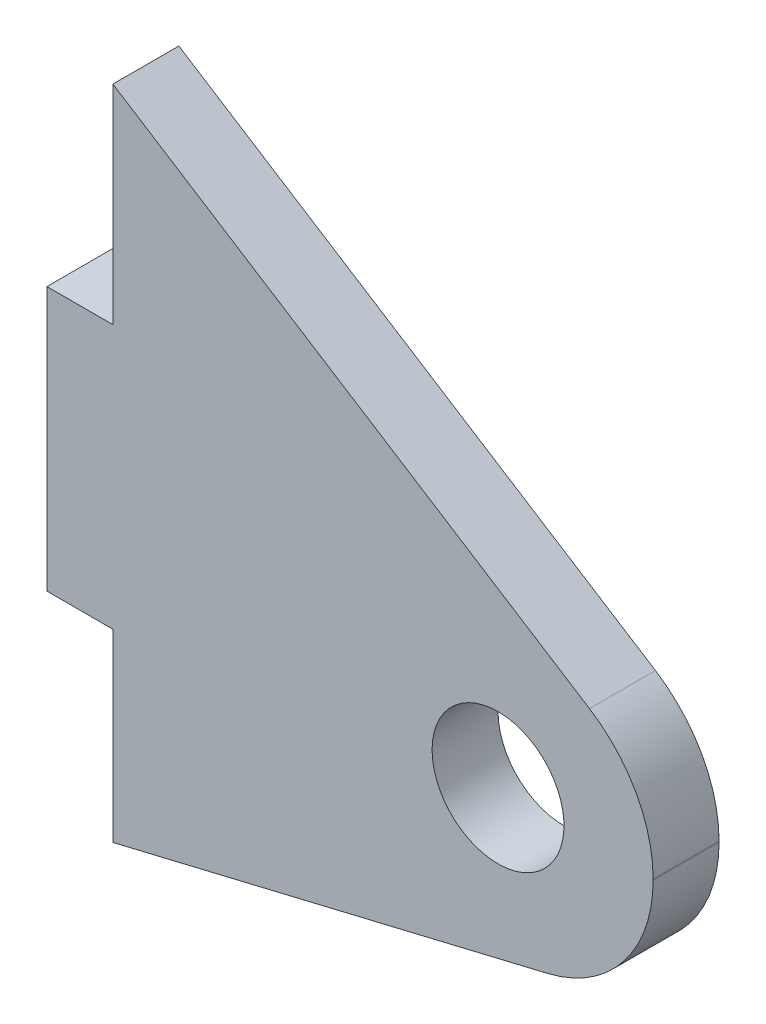
ISO-10303-21;
HEADER;
FILE_DESCRIPTION(('STEP AP214'),'2;1');
FILE_NAME('part.step','',(''),(''),'','','');
FILE_SCHEMA(('AUTOMOTIVE_DESIGN { 1 0 10303 214 1 1 1 1 }'));
ENDSEC;
DATA;
#1=APPLICATION_CONTEXT('core data for automotive mechanical design processes');
#2=APPLICATION_PROTOCOL_DEFINITION('international standard','automotive_design',2000,#1);
#3=PRODUCT_CONTEXT('',#1,'mechanical');
#4=PRODUCT('Part','Part','',(#3));
#5=PRODUCT_RELATED_PRODUCT_CATEGORY('part','',(#4));
#6=PRODUCT_DEFINITION_FORMATION('','',#4);
#7=PRODUCT_DEFINITION_CONTEXT('part definition',#1,'design');
#8=PRODUCT_DEFINITION('design','',#6,#7);
#9=PRODUCT_DEFINITION_SHAPE('','',#8);
#10=(LENGTH_UNIT() NAMED_UNIT(*) SI_UNIT(.MILLI.,.METRE.));
#11=(NAMED_UNIT(*) PLANE_ANGLE_UNIT() SI_UNIT($,.RADIAN.));
#12=(NAMED_UNIT(*) SI_UNIT($,.STERADIAN.) SOLID_ANGLE_UNIT());
#13=UNCERTAINTY_MEASURE_WITH_UNIT(LENGTH_MEASURE(1.E-05),#10,'distance_accuracy_value','');
#14=(GEOMETRIC_REPRESENTATION_CONTEXT(3) GLOBAL_UNCERTAINTY_ASSIGNED_CONTEXT((#13)) GLOBAL_UNIT_ASSIGNED_CONTEXT((#10,
#11,#12)) REPRESENTATION_CONTEXT('',''));
#15=CARTESIAN_POINT('',(0.,0.,0.));
#16=DIRECTION('',(0.,0.,1.));
#17=DIRECTION('',(1.,0.,0.));
#18=AXIS2_PLACEMENT_3D('',#15,#16,#17);
#19=CARTESIAN_POINT('',(0.,64.9120987358869,3.175));
#20=DIRECTION('',(1.,0.,0.));
#21=DIRECTION('',(0.,1.,0.));
#22=AXIS2_PLACEMENT_3D('',#19,#20,#21);
#23=PLANE('',#22);
#24=DIRECTION('',(0.,0.,-1.));
#25=VECTOR('',#24,1.);
#26=CARTESIAN_POINT('',(0.,54.8830926073798,3.175));
#27=LINE('',#26,#25);
#28=CARTESIAN_POINT('',(0.,54.8830926073798,3.175));
#29=VERTEX_POINT('',#28);
#30=CARTESIAN_POINT('',(0.,54.8830926073798,0.));
#31=VERTEX_POINT('',#30);
#32=EDGE_CURVE('E195',#29,#31,#27,.T.);
#33=ORIENTED_EDGE('',*,*,#32,.F.);
#34=DIRECTION('',(0.,-1.,0.));
#35=VECTOR('',#34,1.);
#36=CARTESIAN_POINT('',(0.,64.9120987358869,3.175));
#37=LINE('',#36,#35);
#38=CARTESIAN_POINT('',(0.,64.9120987358869,3.175));
#39=VERTEX_POINT('',#38);
#40=EDGE_CURVE('E138',#39,#29,#37,.T.);
#41=ORIENTED_EDGE('',*,*,#40,.F.);
#42=DIRECTION('',(0.,0.,-1.));
#43=VECTOR('',#42,1.);
#44=CARTESIAN_POINT('',(0.,64.9120987358869,3.175));
#45=LINE('',#44,#43);
#46=CARTESIAN_POINT('',(0.,64.9120987358869,0.));
#47=VERTEX_POINT('',#46);
#48=EDGE_CURVE('E142',#39,#47,#45,.T.);
#49=ORIENTED_EDGE('',*,*,#48,.T.);
#50=DIRECTION('',(0.,-1.,0.));
#51=VECTOR('',#50,1.);
#52=CARTESIAN_POINT('',(0.,64.9120987358869,0.));
#53=LINE('',#52,#51);
#54=EDGE_CURVE('E139',#47,#31,#53,.T.);
#55=ORIENTED_EDGE('',*,*,#54,.T.);
#56=EDGE_LOOP('',(#33,#41,#49,#55));
#57=FACE_BOUND('',#56,.T.);
#58=ADVANCED_FACE('F39',(#57),#23,.F.);
#59=CARTESIAN_POINT('',(0.,42.1830926073798,3.175));
#60=VERTEX_POINT('',#59);
#61=CARTESIAN_POINT('',(0.,33.2930926073798,3.175));
#62=VERTEX_POINT('',#61);
#63=EDGE_CURVE('E128',#60,#62,#37,.T.);
#64=ORIENTED_EDGE('',*,*,#63,.F.);
#65=DIRECTION('',(0.,0.,-1.));
#66=VECTOR('',#65,1.);
#67=CARTESIAN_POINT('',(0.,42.1830926073798,3.175));
#68=LINE('',#67,#66);
#69=CARTESIAN_POINT('',(0.,42.1830926073798,0.));
#70=VERTEX_POINT('',#69);
#71=EDGE_CURVE('E114',#60,#70,#68,.T.);
#72=ORIENTED_EDGE('',*,*,#71,.T.);
#73=CARTESIAN_POINT('',(0.,33.2930926073798,0.));
#74=VERTEX_POINT('',#73);
#75=EDGE_CURVE('E144',#70,#74,#53,.T.);
#76=ORIENTED_EDGE('',*,*,#75,.T.);
#77=DIRECTION('',(0.,0.,-1.));
#78=VECTOR('',#77,1.);
#79=CARTESIAN_POINT('',(0.,33.2930926073798,3.175));
#80=LINE('',#79,#78);
#81=EDGE_CURVE('E137',#62,#74,#80,.T.);
#82=ORIENTED_EDGE('',*,*,#81,.F.);
#83=EDGE_LOOP('',(#64,#72,#76,#82));
#84=FACE_BOUND('',#83,.T.);
#85=ADVANCED_FACE('F135',(#84),#23,.F.);
#86=CARTESIAN_POINT('',(0.,0.,3.175));
#87=DIRECTION('',(0.,0.,1.));
#88=DIRECTION('',(1.,0.,0.));
#89=AXIS2_PLACEMENT_3D('',#86,#87,#88);
#90=PLANE('',#89);
#91=CARTESIAN_POINT('',(18.542,44.8460987358869,3.175));
#92=DIRECTION('',(0.,0.,-1.));
#93=DIRECTION('',(-1.,0.,0.));
#94=AXIS2_PLACEMENT_3D('',#91,#92,#93);
#95=CIRCLE('',#94,3.175);
#96=CARTESIAN_POINT('',(15.367,44.8460987358869,3.175));
#97=VERTEX_POINT('',#96);
#98=EDGE_CURVE('E147',#97,#97,#95,.T.);
#99=ORIENTED_EDGE('',*,*,#98,.T.);
#100=EDGE_LOOP('',(#99));
#101=FACE_BOUND('',#100,.T.);
#102=DIRECTION('',(0.,-1.,0.));
#103=VECTOR('',#102,1.);
#104=CARTESIAN_POINT('',(26.0096,0.,3.175));
#105=LINE('',#104,#103);
#106=CARTESIAN_POINT('',(26.0096,44.7719675224132,3.175));
#107=VERTEX_POINT('',#106);
#108=CARTESIAN_POINT('',(26.0096,44.7232086725945,3.175));
#109=VERTEX_POINT('',#108);
#110=EDGE_CURVE('E171',#107,#109,#105,.T.);
#111=ORIENTED_EDGE('',*,*,#110,.F.);
#112=CARTESIAN_POINT('',(19.4056,44.7719675224132,3.175));
#113=DIRECTION('',(0.,0.,1.));
#114=DIRECTION('',(1.,0.,0.));
#115=AXIS2_PLACEMENT_3D('',#112,#113,#114);
#116=CIRCLE('',#115,6.604);
#117=CARTESIAN_POINT('',(22.9447817524643,50.3475400062953,3.175));
#118=VERTEX_POINT('',#117);
#119=EDGE_CURVE('E47',#107,#118,#116,.T.);
#120=ORIENTED_EDGE('',*,*,#119,.T.);
#121=DIRECTION('',(0.84427202966114,-0.535914862577872,0.));
#122=VECTOR('',#121,1.);
#123=CARTESIAN_POINT('',(29.3699937451269,46.2690363000153,3.175));
#124=LINE('',#123,#122);
#125=EDGE_CURVE('E168',#39,#118,#124,.T.);
#126=ORIENTED_EDGE('',*,*,#125,.F.);
#127=ORIENTED_EDGE('',*,*,#40,.T.);
#128=DIRECTION('',(1.,0.,0.));
#129=VECTOR('',#128,1.);
#130=CARTESIAN_POINT('',(-3.175,54.8830926073798,3.175));
#131=LINE('',#130,#129);
#132=CARTESIAN_POINT('',(-3.175,54.8830926073798,3.175));
#133=VERTEX_POINT('',#132);
#134=EDGE_CURVE('E122',#133,#29,#131,.T.);
#135=ORIENTED_EDGE('',*,*,#134,.F.);
#136=DIRECTION('',(0.,1.,0.));
#137=VECTOR('',#136,1.);
#138=CARTESIAN_POINT('',(-3.175,42.1830926073798,3.175));
#139=LINE('',#138,#137);
#140=CARTESIAN_POINT('',(-3.175,42.1830926073798,3.175));
#141=VERTEX_POINT('',#140);
#142=EDGE_CURVE('E131',#141,#133,#139,.T.);
#143=ORIENTED_EDGE('',*,*,#142,.F.);
#144=DIRECTION('',(-1.,0.,0.));
#145=VECTOR('',#144,1.);
#146=CARTESIAN_POINT('',(0.,42.1830926073798,3.175));
#147=LINE('',#146,#145);
#148=EDGE_CURVE('E117',#60,#141,#147,.T.);
#149=ORIENTED_EDGE('',*,*,#148,.F.);
#150=ORIENTED_EDGE('',*,*,#63,.T.);
#151=DIRECTION('',(-0.972584649940045,-0.232549131800145,0.));
#152=VECTOR('',#151,1.);
#153=CARTESIAN_POINT('',(-7.53002247033558,31.4926321662038,3.175));
#154=LINE('',#153,#152);
#155=CARTESIAN_POINT('',(20.9413544664082,38.3002596443904,3.175));
#156=VERTEX_POINT('',#155);
#157=EDGE_CURVE('E192',#156,#62,#154,.T.);
#158=ORIENTED_EDGE('',*,*,#157,.F.);
#159=CARTESIAN_POINT('',(19.4056,44.7232086725945,3.175));
#160=DIRECTION('',(0.,0.,1.));
#161=DIRECTION('',(1.,0.,0.));
#162=AXIS2_PLACEMENT_3D('',#159,#160,#161);
#163=CIRCLE('',#162,6.604);
#164=EDGE_CURVE('E164',#156,#109,#163,.T.);
#165=ORIENTED_EDGE('',*,*,#164,.T.);
#166=EDGE_LOOP('',(#111,#120,#126,#127,#135,#143,#149,#150,#158,#165));
#167=FACE_BOUND('',#166,.T.);
#168=ADVANCED_FACE('F127',(#101,#167),#90,.T.);
#169=CARTESIAN_POINT('',(0.,0.,0.));
#170=DIRECTION('',(0.,0.,1.));
#171=DIRECTION('',(1.,0.,0.));
#172=AXIS2_PLACEMENT_3D('',#169,#170,#171);
#173=PLANE('',#172);
#174=CARTESIAN_POINT('',(18.542,44.8460987358869,0.));
#175=DIRECTION('',(0.,0.,-1.));
#176=DIRECTION('',(-1.,0.,0.));
#177=AXIS2_PLACEMENT_3D('',#174,#175,#176);
#178=CIRCLE('',#177,3.17499999999999);
#179=CARTESIAN_POINT('',(15.367,44.8460987358869,0.));
#180=VERTEX_POINT('',#179);
#181=EDGE_CURVE('E198',#180,#180,#178,.T.);
#182=ORIENTED_EDGE('',*,*,#181,.F.);
#183=EDGE_LOOP('',(#182));
#184=FACE_BOUND('',#183,.T.);
#185=DIRECTION('',(0.84427202966114,-0.535914862577872,0.));
#186=VECTOR('',#185,1.);
#187=CARTESIAN_POINT('',(29.3699937451269,46.2690363000153,0.));
#188=LINE('',#187,#186);
#189=CARTESIAN_POINT('',(22.9447817524643,50.3475400062953,0.));
#190=VERTEX_POINT('',#189);
#191=EDGE_CURVE('E186',#47,#190,#188,.T.);
#192=ORIENTED_EDGE('',*,*,#191,.T.);
#193=CARTESIAN_POINT('',(19.4056,44.7719675224132,0.));
#194=DIRECTION('',(0.,0.,1.));
#195=DIRECTION('',(1.,0.,0.));
#196=AXIS2_PLACEMENT_3D('',#193,#194,#195);
#197=CIRCLE('',#196,6.604);
#198=CARTESIAN_POINT('',(26.0096,44.7719675224132,0.));
#199=VERTEX_POINT('',#198);
#200=EDGE_CURVE('E157',#190,#199,#197,.F.);
#201=ORIENTED_EDGE('',*,*,#200,.T.);
#202=DIRECTION('',(0.,-1.,0.));
#203=VECTOR('',#202,1.);
#204=CARTESIAN_POINT('',(26.0096,0.,0.));
#205=LINE('',#204,#203);
#206=CARTESIAN_POINT('',(26.0096,44.7232086725945,0.));
#207=VERTEX_POINT('',#206);
#208=EDGE_CURVE('E184',#199,#207,#205,.T.);
#209=ORIENTED_EDGE('',*,*,#208,.T.);
#210=CARTESIAN_POINT('',(19.4056,44.7232086725945,0.));
#211=DIRECTION('',(0.,0.,1.));
#212=DIRECTION('',(1.,0.,0.));
#213=AXIS2_PLACEMENT_3D('',#210,#211,#212);
#214=CIRCLE('',#213,6.604);
#215=CARTESIAN_POINT('',(20.9413544664082,38.3002596443904,0.));
#216=VERTEX_POINT('',#215);
#217=EDGE_CURVE('E155',#207,#216,#214,.F.);
#218=ORIENTED_EDGE('',*,*,#217,.T.);
#219=DIRECTION('',(-0.972584649940045,-0.232549131800145,0.));
#220=VECTOR('',#219,1.);
#221=CARTESIAN_POINT('',(-7.53002247033558,31.4926321662038,0.));
#222=LINE('',#221,#220);
#223=EDGE_CURVE('E190',#216,#74,#222,.T.);
#224=ORIENTED_EDGE('',*,*,#223,.T.);
#225=ORIENTED_EDGE('',*,*,#75,.F.);
#226=DIRECTION('',(-1.,0.,0.));
#227=VECTOR('',#226,1.);
#228=CARTESIAN_POINT('',(0.,42.1830926073798,0.));
#229=LINE('',#228,#227);
#230=CARTESIAN_POINT('',(-3.175,42.1830926073798,0.));
#231=VERTEX_POINT('',#230);
#232=EDGE_CURVE('E54',#70,#231,#229,.T.);
#233=ORIENTED_EDGE('',*,*,#232,.T.);
#234=DIRECTION('',(0.,1.,0.));
#235=VECTOR('',#234,1.);
#236=CARTESIAN_POINT('',(-3.175,42.1830926073798,0.));
#237=LINE('',#236,#235);
#238=CARTESIAN_POINT('',(-3.175,54.8830926073798,0.));
#239=VERTEX_POINT('',#238);
#240=EDGE_CURVE('E216',#231,#239,#237,.T.);
#241=ORIENTED_EDGE('',*,*,#240,.T.);
#242=DIRECTION('',(1.,0.,0.));
#243=VECTOR('',#242,1.);
#244=CARTESIAN_POINT('',(-3.175,54.8830926073798,0.));
#245=LINE('',#244,#243);
#246=EDGE_CURVE('E132',#239,#31,#245,.T.);
#247=ORIENTED_EDGE('',*,*,#246,.T.);
#248=ORIENTED_EDGE('',*,*,#54,.F.);
#249=EDGE_LOOP('',(#192,#201,#209,#218,#224,#225,#233,#241,#247,#248));
#250=FACE_BOUND('',#249,.T.);
#251=ADVANCED_FACE('F183',(#184,#250),#173,.F.);
#252=CARTESIAN_POINT('',(18.542,44.8460987358869,0.));
#253=DIRECTION('',(0.,0.,-1.));
#254=DIRECTION('',(-1.,0.,0.));
#255=AXIS2_PLACEMENT_3D('',#252,#253,#254);
#256=CYLINDRICAL_SURFACE('',#255,3.17499999999999);
#257=ORIENTED_EDGE('',*,*,#98,.F.);
#258=EDGE_LOOP('',(#257));
#259=FACE_BOUND('',#258,.T.);
#260=ORIENTED_EDGE('',*,*,#181,.T.);
#261=EDGE_LOOP('',(#260));
#262=FACE_BOUND('',#261,.T.);
#263=ADVANCED_FACE('F252',(#259,#262),#256,.F.);
#264=CARTESIAN_POINT('',(-7.53002247033558,31.4926321662038,3.175));
#265=DIRECTION('',(0.232549131800145,-0.972584649940044,0.));
#266=DIRECTION('',(0.972584649940044,0.232549131800145,0.));
#267=AXIS2_PLACEMENT_3D('',#264,#265,#266);
#268=PLANE('',#267);
#269=ORIENTED_EDGE('',*,*,#223,.F.);
#270=DIRECTION('',(0.,0.,-1.));
#271=VECTOR('',#270,1.);
#272=CARTESIAN_POINT('',(20.9413544664082,38.3002596443904,3.175));
#273=LINE('',#272,#271);
#274=EDGE_CURVE('E11',#216,#156,#273,.F.);
#275=ORIENTED_EDGE('',*,*,#274,.T.);
#276=ORIENTED_EDGE('',*,*,#157,.T.);
#277=ORIENTED_EDGE('',*,*,#81,.T.);
#278=EDGE_LOOP('',(#269,#275,#276,#277));
#279=FACE_BOUND('',#278,.T.);
#280=ADVANCED_FACE('F205',(#279),#268,.T.);
#281=CARTESIAN_POINT('',(29.3699937451269,46.2690363000153,3.175));
#282=DIRECTION('',(0.535914862577872,0.84427202966114,0.));
#283=DIRECTION('',(-0.84427202966114,0.535914862577872,0.));
#284=AXIS2_PLACEMENT_3D('',#281,#282,#283);
#285=PLANE('',#284);
#286=ORIENTED_EDGE('',*,*,#125,.T.);
#287=DIRECTION('',(0.,0.,-1.));
#288=VECTOR('',#287,1.);
#289=CARTESIAN_POINT('',(22.9447817524643,50.3475400062953,3.175));
#290=LINE('',#289,#288);
#291=EDGE_CURVE('E152',#118,#190,#290,.T.);
#292=ORIENTED_EDGE('',*,*,#291,.T.);
#293=ORIENTED_EDGE('',*,*,#191,.F.);
#294=ORIENTED_EDGE('',*,*,#48,.F.);
#295=EDGE_LOOP('',(#286,#292,#293,#294));
#296=FACE_BOUND('',#295,.T.);
#297=ADVANCED_FACE('F176',(#296),#285,.T.);
#298=CARTESIAN_POINT('',(26.0096,0.,3.175));
#299=DIRECTION('',(1.,0.,0.));
#300=DIRECTION('',(0.,1.,0.));
#301=AXIS2_PLACEMENT_3D('',#298,#299,#300);
#302=PLANE('',#301);
#303=ORIENTED_EDGE('',*,*,#208,.F.);
#304=DIRECTION('',(0.,0.,-1.));
#305=VECTOR('',#304,1.);
#306=CARTESIAN_POINT('',(26.0096,44.7719675224132,3.175));
#307=LINE('',#306,#305);
#308=EDGE_CURVE('E162',#199,#107,#307,.F.);
#309=ORIENTED_EDGE('',*,*,#308,.T.);
#310=ORIENTED_EDGE('',*,*,#110,.T.);
#311=DIRECTION('',(0.,0.,-1.));
#312=VECTOR('',#311,1.);
#313=CARTESIAN_POINT('',(26.0096,44.7232086725945,3.175));
#314=LINE('',#313,#312);
#315=EDGE_CURVE('E159',#109,#207,#314,.T.);
#316=ORIENTED_EDGE('',*,*,#315,.T.);
#317=EDGE_LOOP('',(#303,#309,#310,#316));
#318=FACE_BOUND('',#317,.T.);
#319=ADVANCED_FACE('F188',(#318),#302,.T.);
#320=CARTESIAN_POINT('',(19.4056,44.7719675224132,3.175));
#321=DIRECTION('',(0.,0.,-1.));
#322=DIRECTION('',(-1.,0.,0.));
#323=AXIS2_PLACEMENT_3D('',#320,#321,#322);
#324=CYLINDRICAL_SURFACE('',#323,6.604);
#325=ORIENTED_EDGE('',*,*,#119,.F.);
#326=ORIENTED_EDGE('',*,*,#308,.F.);
#327=ORIENTED_EDGE('',*,*,#200,.F.);
#328=ORIENTED_EDGE('',*,*,#291,.F.);
#329=EDGE_LOOP('',(#325,#326,#327,#328));
#330=FACE_BOUND('',#329,.T.);
#331=ADVANCED_FACE('F179',(#330),#324,.T.);
#332=CARTESIAN_POINT('',(19.4056,44.7232086725945,3.175));
#333=DIRECTION('',(0.,0.,-1.));
#334=DIRECTION('',(-1.,0.,0.));
#335=AXIS2_PLACEMENT_3D('',#332,#333,#334);
#336=CYLINDRICAL_SURFACE('',#335,6.604);
#337=ORIENTED_EDGE('',*,*,#164,.F.);
#338=ORIENTED_EDGE('',*,*,#274,.F.);
#339=ORIENTED_EDGE('',*,*,#217,.F.);
#340=ORIENTED_EDGE('',*,*,#315,.F.);
#341=EDGE_LOOP('',(#337,#338,#339,#340));
#342=FACE_BOUND('',#341,.T.);
#343=ADVANCED_FACE('F41',(#342),#336,.T.);
#344=CARTESIAN_POINT('',(-3.175,54.8830926073798,3.175));
#345=DIRECTION('',(0.,1.,0.));
#346=DIRECTION('',(0.,0.,1.));
#347=AXIS2_PLACEMENT_3D('',#344,#345,#346);
#348=PLANE('',#347);
#349=ORIENTED_EDGE('',*,*,#246,.F.);
#350=DIRECTION('',(0.,0.,-1.));
#351=VECTOR('',#350,1.);
#352=CARTESIAN_POINT('',(-3.175,54.8830926073798,3.175));
#353=LINE('',#352,#351);
#354=EDGE_CURVE('E211',#133,#239,#353,.T.);
#355=ORIENTED_EDGE('',*,*,#354,.F.);
#356=ORIENTED_EDGE('',*,*,#134,.T.);
#357=ORIENTED_EDGE('',*,*,#32,.T.);
#358=EDGE_LOOP('',(#349,#355,#356,#357));
#359=FACE_BOUND('',#358,.T.);
#360=ADVANCED_FACE('F227',(#359),#348,.T.);
#361=CARTESIAN_POINT('',(-3.175,42.1830926073798,3.175));
#362=DIRECTION('',(-1.,0.,0.));
#363=DIRECTION('',(0.,0.,1.));
#364=AXIS2_PLACEMENT_3D('',#361,#362,#363);
#365=PLANE('',#364);
#366=ORIENTED_EDGE('',*,*,#240,.F.);
#367=DIRECTION('',(0.,0.,-1.));
#368=VECTOR('',#367,1.);
#369=CARTESIAN_POINT('',(-3.175,42.1830926073798,3.175));
#370=LINE('',#369,#368);
#371=EDGE_CURVE('E121',#141,#231,#370,.T.);
#372=ORIENTED_EDGE('',*,*,#371,.F.);
#373=ORIENTED_EDGE('',*,*,#142,.T.);
#374=ORIENTED_EDGE('',*,*,#354,.T.);
#375=EDGE_LOOP('',(#366,#372,#373,#374));
#376=FACE_BOUND('',#375,.T.);
#377=ADVANCED_FACE('F223',(#376),#365,.T.);
#378=CARTESIAN_POINT('',(0.,42.1830926073798,3.175));
#379=DIRECTION('',(0.,-1.,0.));
#380=DIRECTION('',(0.,0.,-1.));
#381=AXIS2_PLACEMENT_3D('',#378,#379,#380);
#382=PLANE('',#381);
#383=ORIENTED_EDGE('',*,*,#232,.F.);
#384=ORIENTED_EDGE('',*,*,#71,.F.);
#385=ORIENTED_EDGE('',*,*,#148,.T.);
#386=ORIENTED_EDGE('',*,*,#371,.T.);
#387=EDGE_LOOP('',(#383,#384,#385,#386));
#388=FACE_BOUND('',#387,.T.);
#389=ADVANCED_FACE('F116',(#388),#382,.T.);
#390=CLOSED_SHELL('',(#58,#85,#168,#251,#263,#280,#297,#319,#331,#343,#360,#377,#389));
#391=MANIFOLD_SOLID_BREP('B2',#390);
#392=ADVANCED_BREP_SHAPE_REPRESENTATION('',(#18,#391),#14);
#393=SHAPE_DEFINITION_REPRESENTATION(#9,#392);
ENDSEC;
END-ISO-10303-21;
